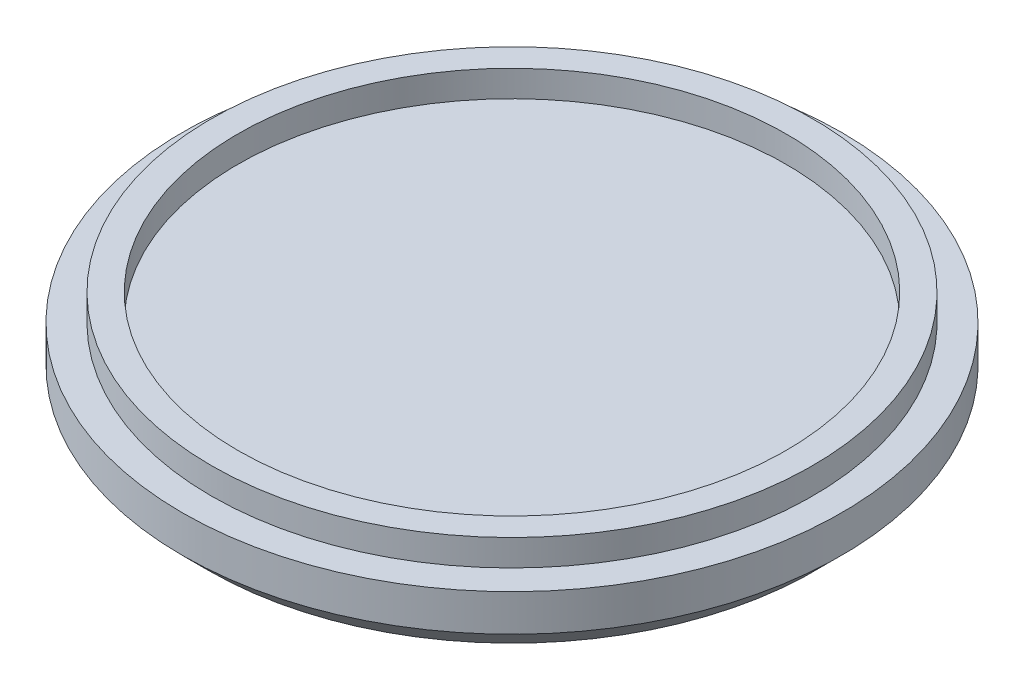
ISO-10303-21;
HEADER;
FILE_DESCRIPTION(('STEP AP214'),'2;1');
FILE_NAME('part.step','',(''),(''),'','','');
FILE_SCHEMA(('AUTOMOTIVE_DESIGN { 1 0 10303 214 1 1 1 1 }'));
ENDSEC;
DATA;
#1=APPLICATION_CONTEXT('core data for automotive mechanical design processes');
#2=APPLICATION_PROTOCOL_DEFINITION('international standard','automotive_design',2000,#1);
#3=PRODUCT_CONTEXT('',#1,'mechanical');
#4=PRODUCT('Part','Part','',(#3));
#5=PRODUCT_RELATED_PRODUCT_CATEGORY('part','',(#4));
#6=PRODUCT_DEFINITION_FORMATION('','',#4);
#7=PRODUCT_DEFINITION_CONTEXT('part definition',#1,'design');
#8=PRODUCT_DEFINITION('design','',#6,#7);
#9=PRODUCT_DEFINITION_SHAPE('','',#8);
#10=(LENGTH_UNIT() NAMED_UNIT(*) SI_UNIT(.MILLI.,.METRE.));
#11=(NAMED_UNIT(*) PLANE_ANGLE_UNIT() SI_UNIT($,.RADIAN.));
#12=(NAMED_UNIT(*) SI_UNIT($,.STERADIAN.) SOLID_ANGLE_UNIT());
#13=UNCERTAINTY_MEASURE_WITH_UNIT(LENGTH_MEASURE(1.E-05),#10,'distance_accuracy_value','');
#14=(GEOMETRIC_REPRESENTATION_CONTEXT(3) GLOBAL_UNCERTAINTY_ASSIGNED_CONTEXT((#13)) GLOBAL_UNIT_ASSIGNED_CONTEXT((#10,
#11,#12)) REPRESENTATION_CONTEXT('',''));
#15=CARTESIAN_POINT('',(0.,0.,0.));
#16=DIRECTION('',(0.,0.,1.));
#17=DIRECTION('',(1.,0.,0.));
#18=AXIS2_PLACEMENT_3D('',#15,#16,#17);
#19=CARTESIAN_POINT('',(0.,-1.,0.));
#20=DIRECTION('',(0.,1.,0.));
#21=DIRECTION('',(0.,0.,1.));
#22=AXIS2_PLACEMENT_3D('',#19,#20,#21);
#23=PLANE('',#22);
#24=CARTESIAN_POINT('',(0.,-1.,0.));
#25=DIRECTION('',(0.,1.,0.));
#26=DIRECTION('',(0.,0.,1.));
#27=AXIS2_PLACEMENT_3D('',#24,#25,#26);
#28=CIRCLE('',#27,11.5);
#29=CARTESIAN_POINT('',(0.,-1.,11.5));
#30=VERTEX_POINT('',#29);
#31=EDGE_CURVE('E11',#30,#30,#28,.F.);
#32=ORIENTED_EDGE('',*,*,#31,.T.);
#33=EDGE_LOOP('',(#32));
#34=FACE_BOUND('',#33,.T.);
#35=CARTESIAN_POINT('',(5.367578125,-1.,5.43046875));
#36=CARTESIAN_POINT('',(5.36437230296155,-1.,5.35440191543509));
#37=CARTESIAN_POINT('',(5.35815827664223,-1.,5.20695726431481));
#38=CARTESIAN_POINT('',(5.29648330608868,-1.,4.99729757865907));
#39=CARTESIAN_POINT('',(5.19277992319313,-1.,4.81306964596893));
#40=CARTESIAN_POINT('',(5.05070631821768,-1.,4.65323275377291));
#41=CARTESIAN_POINT('',(4.86555527245483,-1.,4.52562779840332));
#42=CARTESIAN_POINT('',(4.63797949496496,-1.,4.43505410252606));
#43=CARTESIAN_POINT('',(4.36887539757215,-1.,4.38586525879475));
#44=CARTESIAN_POINT('',(4.17650128704972,-1.,4.37877159736387));
#45=CARTESIAN_POINT('',(4.07421875,-1.,4.375));
#46=B_SPLINE_CURVE_WITH_KNOTS('',3,(#35,#36,#37,#38,#39,#40,#41,#42,#43,#44,#45),.UNSPECIFIED.,
.F.,.F.,(4,1,1,1,1,1,1,1,4),(0.,0.120267436748243,0.233121180260789,0.342370477685897,
0.452806012897153,0.568964289925495,0.695252155971452,0.837969971307345,1.),.UNSPECIFIED.);
#47=CARTESIAN_POINT('',(5.367578125,-1.,5.43046875));
#48=VERTEX_POINT('',#47);
#49=CARTESIAN_POINT('',(4.07421875,-1.,4.375));
#50=VERTEX_POINT('',#49);
#51=EDGE_CURVE('E48',#48,#50,#46,.T.);
#52=ORIENTED_EDGE('',*,*,#51,.T.);
#53=DIRECTION('',(-1.,0.,0.));
#54=VECTOR('',#53,1.);
#55=CARTESIAN_POINT('',(4.07421875,-1.,4.375));
#56=LINE('',#55,#54);
#57=CARTESIAN_POINT('',(-2.1,-1.,4.375));
#58=VERTEX_POINT('',#57);
#59=EDGE_CURVE('E379',#50,#58,#56,.T.);
#60=ORIENTED_EDGE('',*,*,#59,.T.);
#61=DIRECTION('',(0.,0.,-1.));
#62=VECTOR('',#61,1.);
#63=CARTESIAN_POINT('',(-2.1,-1.,4.375));
#64=LINE('',#63,#62);
#65=CARTESIAN_POINT('',(-2.1,-1.,1.05));
#66=VERTEX_POINT('',#65);
#67=EDGE_CURVE('E373',#58,#66,#64,.T.);
#68=ORIENTED_EDGE('',*,*,#67,.T.);
#69=DIRECTION('',(1.,0.,0.));
#70=VECTOR('',#69,1.);
#71=CARTESIAN_POINT('',(-2.1,-1.,1.05));
#72=LINE('',#71,#70);
#73=CARTESIAN_POINT('',(3.584765625,-1.,1.05));
#74=VERTEX_POINT('',#73);
#75=EDGE_CURVE('E378',#66,#74,#72,.T.);
#76=ORIENTED_EDGE('',*,*,#75,.T.);
#77=CARTESIAN_POINT('',(3.584765625,-1.,1.05));
#78=CARTESIAN_POINT('',(3.68341449567231,-1.,1.04626656115688));
#79=CARTESIAN_POINT('',(3.86858414946334,-1.,1.0392586798368));
#80=CARTESIAN_POINT('',(4.1277865845284,-1.,0.989689139155299));
#81=CARTESIAN_POINT('',(4.34699953762024,-1.,0.89870666903668));
#82=CARTESIAN_POINT('',(4.52533846175112,-1.,0.771743668816875));
#83=CARTESIAN_POINT('',(4.66230356322709,-1.,0.613832259418921));
#84=CARTESIAN_POINT('',(4.76298643354768,-1.,0.433813713452389));
#85=CARTESIAN_POINT('',(4.82184761778007,-1.,0.227789390492696));
#86=CARTESIAN_POINT('',(4.82829028696809,-1.,0.0833269557132631));
#87=CARTESIAN_POINT('',(4.831640625,-1.,0.00820312499999996));
#88=B_SPLINE_CURVE_WITH_KNOTS('',3,(#77,#78,#79,#80,#81,#82,#83,#84,#85,#86,#87),.UNSPECIFIED.,
.F.,.F.,(4,1,1,1,1,1,1,1,4),(0.,0.160661654013715,0.301571246061575,0.42729825318686,
0.544300414853506,0.654763056228304,0.76506598287453,0.877828839322363,1.),.UNSPECIFIED.);
#89=CARTESIAN_POINT('',(4.831640625,-1.,0.00820312499999996));
#90=VERTEX_POINT('',#89);
#91=EDGE_CURVE('E385',#74,#90,#88,.T.);
#92=ORIENTED_EDGE('',*,*,#91,.T.);
#93=CARTESIAN_POINT('',(4.831640625,-1.,0.00820312499999997));
#94=CARTESIAN_POINT('',(4.82838441400993,-1.,-0.0669667363365613));
#95=CARTESIAN_POINT('',(4.82212275025669,-1.,-0.211517687580781));
#96=CARTESIAN_POINT('',(4.76188896519159,-1.,-0.417277321257992));
#97=CARTESIAN_POINT('',(4.66492270443365,-1.,-0.601078260333811));
#98=CARTESIAN_POINT('',(4.52926834917098,-1.,-0.762310942338436));
#99=CARTESIAN_POINT('',(4.35240605689093,-1.,-0.893955903013384));
#100=CARTESIAN_POINT('',(4.13263734813538,-1.,-0.987206531621962));
#101=CARTESIAN_POINT('',(3.87160916719781,-1.,-1.03998696544967));
#102=CARTESIAN_POINT('',(3.68436834679015,-1.,-1.0465231028492));
#103=CARTESIAN_POINT('',(3.584765625,-1.,-1.05));
#104=B_SPLINE_CURVE_WITH_KNOTS('',3,(#93,#94,#95,#96,#97,#98,#99,#100,#101,#102,#103),
.UNSPECIFIED.,.F.,.F.,(4,1,1,1,1,1,1,1,4),(0.,0.121400030250187,0.233451140413456,
0.343651818902743,0.455654369536033,0.57159941871975,0.697114970678647,0.838880361428578,1.),.UNSPECIFIED.);
#105=CARTESIAN_POINT('',(3.584765625,-1.,-1.05));
#106=VERTEX_POINT('',#105);
#107=EDGE_CURVE('E390',#90,#106,#104,.T.);
#108=ORIENTED_EDGE('',*,*,#107,.T.);
#109=DIRECTION('',(-1.,0.,0.));
#110=VECTOR('',#109,1.);
#111=CARTESIAN_POINT('',(3.584765625,-1.,-1.05));
#112=LINE('',#111,#110);
#113=CARTESIAN_POINT('',(-2.1,-1.,-1.05));
#114=VERTEX_POINT('',#113);
#115=EDGE_CURVE('E398',#106,#114,#112,.T.);
#116=ORIENTED_EDGE('',*,*,#115,.T.);
#117=DIRECTION('',(0.,0.,-1.));
#118=VECTOR('',#117,1.);
#119=CARTESIAN_POINT('',(-2.1,-1.,-1.05));
#120=LINE('',#119,#118);
#121=CARTESIAN_POINT('',(-2.1,-1.,-4.9));
#122=VERTEX_POINT('',#121);
#123=EDGE_CURVE('E404',#114,#122,#120,.T.);
#124=ORIENTED_EDGE('',*,*,#123,.T.);
#125=DIRECTION('',(1.,0.,0.));
#126=VECTOR('',#125,1.);
#127=CARTESIAN_POINT('',(-2.1,-1.,-4.9));
#128=LINE('',#127,#126);
#129=CARTESIAN_POINT('',(4.2875,-1.,-4.9));
#130=VERTEX_POINT('',#129);
#131=EDGE_CURVE('E407',#122,#130,#128,.T.);
#132=ORIENTED_EDGE('',*,*,#131,.T.);
#133=CARTESIAN_POINT('',(4.2875,-1.,-4.9));
#134=CARTESIAN_POINT('',(4.38886184812434,-1.,-4.90379275059417));
#135=CARTESIAN_POINT('',(4.5794112832911,-1.,-4.91092271612677));
#136=CARTESIAN_POINT('',(4.84799230211396,-1.,-4.96015881419502));
#137=CARTESIAN_POINT('',(5.07559711195545,-1.,-5.05368552483259));
#138=CARTESIAN_POINT('',(5.26354382497766,-1.,-5.18172291774743));
#139=CARTESIAN_POINT('',(5.4120720353827,-1.,-5.3388727124249));
#140=CARTESIAN_POINT('',(5.51423593448541,-1.,-5.52574012933387));
#141=CARTESIAN_POINT('',(5.58059817021118,-1.,-5.73409934249324));
#142=CARTESIAN_POINT('',(5.58618524402794,-1.,-5.88202415245683));
#143=CARTESIAN_POINT('',(5.5890625,-1.,-5.958203125));
#144=B_SPLINE_CURVE_WITH_KNOTS('',3,(#133,#134,#135,#136,#137,#138,#139,#140,#141,#142,#143),
.UNSPECIFIED.,.F.,.F.,(4,1,1,1,1,1,1,1,4),(0.,0.160176505908495,0.301114702352376,
0.428957738056688,0.546002067235564,0.6580950950732,0.767063780429466,0.880041475940768,1.),.UNSPECIFIED.);
#145=CARTESIAN_POINT('',(5.5890625,-1.,-5.958203125));
#146=VERTEX_POINT('',#145);
#147=EDGE_CURVE('E410',#130,#146,#144,.T.);
#148=ORIENTED_EDGE('',*,*,#147,.T.);
#149=CARTESIAN_POINT('',(5.5890625,-1.,-5.958203125));
#150=CARTESIAN_POINT('',(5.58633538018358,-1.,-6.03261807672392));
#151=CARTESIAN_POINT('',(5.58107292391009,-1.,-6.17621478530384));
#152=CARTESIAN_POINT('',(5.51303845753953,-1.,-6.37858834799083));
#153=CARTESIAN_POINT('',(5.41133352125437,-1.,-6.5616104927131));
#154=CARTESIAN_POINT('',(5.26351397034971,-1.,-6.71807976456861));
#155=CARTESIAN_POINT('',(5.07623013844445,-1.,-6.84709167358586));
#156=CARTESIAN_POINT('',(4.84693187950366,-1.,-6.93546425434473));
#157=CARTESIAN_POINT('',(4.57991783779053,-1.,-6.99038682997221));
#158=CARTESIAN_POINT('',(4.38897467859842,-1.,-6.99666404297955));
#159=CARTESIAN_POINT('',(4.2875,-1.,-7.));
#160=B_SPLINE_CURVE_WITH_KNOTS('',3,(#149,#150,#151,#152,#153,#154,#155,#156,#157,#158,#159),
.UNSPECIFIED.,.F.,.F.,(4,1,1,1,1,1,1,1,4),(0.,0.118093013228401,0.22788119340316,
0.336519929743449,0.449574496185942,0.567622836436301,0.696013187536239,0.838449493433363,1.),.UNSPECIFIED.);
#161=CARTESIAN_POINT('',(4.2875,-1.,-7.));
#162=VERTEX_POINT('',#161);
#163=EDGE_CURVE('E415',#146,#162,#160,.T.);
#164=ORIENTED_EDGE('',*,*,#163,.T.);
#165=DIRECTION('',(-1.,0.,0.));
#166=VECTOR('',#165,1.);
#167=CARTESIAN_POINT('',(4.2875,-1.,-7.));
#168=LINE('',#167,#166);
#169=CARTESIAN_POINT('',(-3.1171875,-1.,-7.));
#170=VERTEX_POINT('',#169);
#171=EDGE_CURVE('E423',#162,#170,#168,.T.);
#172=ORIENTED_EDGE('',*,*,#171,.T.);
#173=CARTESIAN_POINT('',(-3.1171875,-1.,-7.));
#174=CARTESIAN_POINT('',(-3.25066868467936,-1.,-6.99611551407907));
#175=CARTESIAN_POINT('',(-3.49906251297289,-1.,-6.98888691230145));
#176=CARTESIAN_POINT('',(-3.8432108007353,-1.,-6.91545739975956));
#177=CARTESIAN_POINT('',(-4.13006516991292,-1.,-6.79400226117398));
#178=CARTESIAN_POINT('',(-4.36192116553861,-1.,-6.61532370776271));
#179=CARTESIAN_POINT('',(-4.529538591319,-1.,-6.37269325533188));
#180=CARTESIAN_POINT('',(-4.64656338462461,-1.,-6.07559185061921));
#181=CARTESIAN_POINT('',(-4.71182823399441,-1.,-5.71943912615384));
#182=CARTESIAN_POINT('',(-4.7204071678615,-1.,-5.46355372762279));
#183=CARTESIAN_POINT('',(-4.725,-1.,-5.3265625));
#184=B_SPLINE_CURVE_WITH_KNOTS('',3,(#173,#174,#175,#176,#177,#178,#179,#180,#181,#182,#183),
.UNSPECIFIED.,.F.,.F.,(4,1,1,1,1,1,1,1,4),(0.,0.148682021362969,0.276680916291554,
0.389999231123065,0.493501638371598,0.598426672552619,0.714696995015976,0.847259714225205,1.),.UNSPECIFIED.);
#185=CARTESIAN_POINT('',(-4.725,-1.,-5.3265625));
#186=VERTEX_POINT('',#185);
#187=EDGE_CURVE('E237',#170,#186,#184,.T.);
#188=ORIENTED_EDGE('',*,*,#187,.T.);
#189=DIRECTION('',(0.,0.,1.));
#190=VECTOR('',#189,1.);
#191=CARTESIAN_POINT('',(-4.725,-1.,-5.3265625));
#192=LINE('',#191,#190);
#193=CARTESIAN_POINT('',(-4.725,-1.,4.8015625));
#194=VERTEX_POINT('',#193);
#195=EDGE_CURVE('E431',#186,#194,#192,.T.);
#196=ORIENTED_EDGE('',*,*,#195,.T.);
#197=CARTESIAN_POINT('',(-4.725,-1.,4.8015625));
#198=CARTESIAN_POINT('',(-4.72289779159157,-1.,4.89552937523254));
#199=CARTESIAN_POINT('',(-4.7189059328463,-1.,5.07396196600636));
#200=CARTESIAN_POINT('',(-4.68921580138169,-1.,5.32867023836611));
#201=CARTESIAN_POINT('',(-4.63869875914601,-1.,5.55670945994587));
#202=CARTESIAN_POINT('',(-4.56438018871056,-1.,5.75913159386267));
#203=CARTESIAN_POINT('',(-4.46949905085583,-1.,5.9373047813468));
#204=CARTESIAN_POINT('',(-4.34645141256345,-1.,6.08809929208549));
#205=CARTESIAN_POINT('',(-4.19939462791895,-1.,6.21204695528725));
#206=CARTESIAN_POINT('',(-4.02955356301455,-1.,6.31260917234554));
#207=CARTESIAN_POINT('',(-3.83445723867178,-1.,6.38451080521653));
#208=CARTESIAN_POINT('',(-3.61760933418587,-1.,6.44045174902036));
#209=CARTESIAN_POINT('',(-3.37493357291449,-1.,6.46836998625932));
#210=CARTESIAN_POINT('',(-3.20565362263131,-1.,6.47272438197798));
#211=CARTESIAN_POINT('',(-3.1171875,-1.,6.475));
#212=B_SPLINE_CURVE_WITH_KNOTS('',3,(#197,#198,#199,#200,#201,#202,#203,#204,#205,#206,#207,
#208,#209,#210,#211),.UNSPECIFIED.,.F.,.F.,(4,1,1,1,1,1,1,1,1,1,1,1,4),(0.,0.104758116804265,
0.19892395208114,0.285459035487324,0.36456110534906,0.438695516580397,0.509487423231466,
0.580147895594877,0.65213343509275,0.72838325770038,0.811204159196715,0.901334824491364,1.),.UNSPECIFIED.);
#213=CARTESIAN_POINT('',(-3.1171875,-1.,6.475));
#214=VERTEX_POINT('',#213);
#215=EDGE_CURVE('E437',#194,#214,#212,.T.);
#216=ORIENTED_EDGE('',*,*,#215,.T.);
#217=DIRECTION('',(1.,0.,0.));
#218=VECTOR('',#217,1.);
#219=CARTESIAN_POINT('',(-3.1171875,-1.,6.475));
#220=LINE('',#219,#218);
#221=CARTESIAN_POINT('',(4.07421875,-1.,6.475));
#222=VERTEX_POINT('',#221);
#223=EDGE_CURVE('E176',#214,#222,#220,.T.);
#224=ORIENTED_EDGE('',*,*,#223,.T.);
#225=CARTESIAN_POINT('',(4.07421875,-1.,6.475));
#226=CARTESIAN_POINT('',(4.17645748059266,-1.,6.4711267649805));
#227=CARTESIAN_POINT('',(4.36874919945318,-1.,6.46384194233908));
#228=CARTESIAN_POINT('',(4.63873950663626,-1.,6.41584694775768));
#229=CARTESIAN_POINT('',(4.86487627937923,-1.,6.32101396932608));
#230=CARTESIAN_POINT('',(5.05099486883944,-1.,6.19434624982811));
#231=CARTESIAN_POINT('',(5.19096954122455,-1.,6.03491856439499));
#232=CARTESIAN_POINT('',(5.29730221534378,-1.,5.85517912332123));
#233=CARTESIAN_POINT('',(5.35773804968325,-1.,5.64934083002644));
#234=CARTESIAN_POINT('',(5.36424200862952,-1.,5.5046737439368));
#235=CARTESIAN_POINT('',(5.367578125,-1.,5.43046875));
#236=B_SPLINE_CURVE_WITH_KNOTS('',3,(#225,#226,#227,#228,#229,#230,#231,#232,#233,#234,#235),
.UNSPECIFIED.,.F.,.F.,(4,1,1,1,1,1,1,1,4),(0.,0.163044135156241,0.306655186518622,
0.434288730944417,0.551174014321422,0.662300738634914,0.769708499501093,0.881875139258483,1.),.UNSPECIFIED.);
#237=EDGE_CURVE('E330',#222,#48,#236,.T.);
#238=ORIENTED_EDGE('',*,*,#237,.T.);
#239=EDGE_LOOP('',(#52,#60,#68,#76,#92,#108,#116,#124,#132,#148,#164,#172,#188,#196,#216,#224,#238));
#240=FACE_BOUND('',#239,.T.);
#241=ADVANCED_FACE('F33',(#34,#240),#23,.F.);
#242=CARTESIAN_POINT('',(0.,-1.,0.));
#243=DIRECTION('',(0.,1.,0.));
#244=DIRECTION('',(0.,0.,1.));
#245=AXIS2_PLACEMENT_3D('',#242,#243,#244);
#246=CYLINDRICAL_SURFACE('',#245,12.5);
#247=CARTESIAN_POINT('',(0.,0.,0.));
#248=DIRECTION('',(0.,1.,0.));
#249=DIRECTION('',(0.,0.,1.));
#250=AXIS2_PLACEMENT_3D('',#247,#248,#249);
#251=CIRCLE('',#250,12.5);
#252=CARTESIAN_POINT('',(0.,0.,12.5));
#253=VERTEX_POINT('',#252);
#254=EDGE_CURVE('E41',#253,#253,#251,.T.);
#255=ORIENTED_EDGE('',*,*,#254,.T.);
#256=EDGE_LOOP('',(#255));
#257=FACE_BOUND('',#256,.T.);
#258=CARTESIAN_POINT('',(0.,1.4,0.));
#259=DIRECTION('',(0.,1.,0.));
#260=DIRECTION('',(0.,0.,1.));
#261=AXIS2_PLACEMENT_3D('',#258,#259,#260);
#262=CIRCLE('',#261,12.5);
#263=CARTESIAN_POINT('',(0.,1.4,12.5));
#264=VERTEX_POINT('',#263);
#265=EDGE_CURVE('E274',#264,#264,#262,.T.);
#266=ORIENTED_EDGE('',*,*,#265,.F.);
#267=EDGE_LOOP('',(#266));
#268=FACE_BOUND('',#267,.T.);
#269=ADVANCED_FACE('F284',(#257,#268),#246,.T.);
#270=CARTESIAN_POINT('',(0.,1.4,0.));
#271=DIRECTION('',(0.,1.,0.));
#272=DIRECTION('',(0.,0.,1.));
#273=AXIS2_PLACEMENT_3D('',#270,#271,#272);
#274=PLANE('',#273);
#275=CARTESIAN_POINT('',(0.,1.4,0.));
#276=DIRECTION('',(0.,1.,0.));
#277=DIRECTION('',(0.,0.,1.));
#278=AXIS2_PLACEMENT_3D('',#275,#276,#277);
#279=CIRCLE('',#278,11.4);
#280=CARTESIAN_POINT('',(0.,1.4,11.4));
#281=VERTEX_POINT('',#280);
#282=EDGE_CURVE('E270',#281,#281,#279,.T.);
#283=ORIENTED_EDGE('',*,*,#282,.F.);
#284=EDGE_LOOP('',(#283));
#285=FACE_BOUND('',#284,.T.);
#286=ORIENTED_EDGE('',*,*,#265,.T.);
#287=EDGE_LOOP('',(#286));
#288=FACE_BOUND('',#287,.T.);
#289=ADVANCED_FACE('F300',(#285,#288),#274,.T.);
#290=CARTESIAN_POINT('',(0.,2.4,0.));
#291=DIRECTION('',(0.,1.,0.));
#292=DIRECTION('',(0.,0.,1.));
#293=AXIS2_PLACEMENT_3D('',#290,#291,#292);
#294=PLANE('',#293);
#295=CARTESIAN_POINT('',(0.,2.4,0.));
#296=DIRECTION('',(0.,1.,0.));
#297=DIRECTION('',(0.,0.,1.));
#298=AXIS2_PLACEMENT_3D('',#295,#296,#297);
#299=CIRCLE('',#298,11.4);
#300=CARTESIAN_POINT('',(0.,2.4,11.4));
#301=VERTEX_POINT('',#300);
#302=EDGE_CURVE('E271',#301,#301,#299,.T.);
#303=ORIENTED_EDGE('',*,*,#302,.T.);
#304=EDGE_LOOP('',(#303));
#305=FACE_BOUND('',#304,.T.);
#306=CARTESIAN_POINT('',(0.,2.4,0.));
#307=DIRECTION('',(0.,1.,0.));
#308=DIRECTION('',(0.,0.,1.));
#309=AXIS2_PLACEMENT_3D('',#306,#307,#308);
#310=CIRCLE('',#309,10.4);
#311=CARTESIAN_POINT('',(0.,2.4,10.4));
#312=VERTEX_POINT('',#311);
#313=EDGE_CURVE('E267',#312,#312,#310,.T.);
#314=ORIENTED_EDGE('',*,*,#313,.F.);
#315=EDGE_LOOP('',(#314));
#316=FACE_BOUND('',#315,.T.);
#317=ADVANCED_FACE('F311',(#305,#316),#294,.T.);
#318=CARTESIAN_POINT('',(0.,2.4,0.));
#319=DIRECTION('',(0.,-1.,0.));
#320=DIRECTION('',(0.,0.,-1.));
#321=AXIS2_PLACEMENT_3D('',#318,#319,#320);
#322=CYLINDRICAL_SURFACE('',#321,11.4);
#323=ORIENTED_EDGE('',*,*,#302,.F.);
#324=EDGE_LOOP('',(#323));
#325=FACE_BOUND('',#324,.T.);
#326=ORIENTED_EDGE('',*,*,#282,.T.);
#327=EDGE_LOOP('',(#326));
#328=FACE_BOUND('',#327,.T.);
#329=ADVANCED_FACE('F313',(#325,#328),#322,.T.);
#330=CARTESIAN_POINT('',(0.,2.4,0.));
#331=DIRECTION('',(0.,-1.,0.));
#332=DIRECTION('',(0.,0.,-1.));
#333=AXIS2_PLACEMENT_3D('',#330,#331,#332);
#334=CYLINDRICAL_SURFACE('',#333,10.4);
#335=ORIENTED_EDGE('',*,*,#313,.T.);
#336=EDGE_LOOP('',(#335));
#337=FACE_BOUND('',#336,.T.);
#338=CARTESIAN_POINT('',(0.,1.4,0.));
#339=DIRECTION('',(0.,1.,0.));
#340=DIRECTION('',(0.,0.,1.));
#341=AXIS2_PLACEMENT_3D('',#338,#339,#340);
#342=CIRCLE('',#341,10.4);
#343=CARTESIAN_POINT('',(0.,1.4,10.4));
#344=VERTEX_POINT('',#343);
#345=EDGE_CURVE('E279',#344,#344,#342,.F.);
#346=ORIENTED_EDGE('',*,*,#345,.T.);
#347=EDGE_LOOP('',(#346));
#348=FACE_BOUND('',#347,.T.);
#349=ADVANCED_FACE('F297',(#337,#348),#334,.F.);
#350=ORIENTED_EDGE('',*,*,#345,.F.);
#351=EDGE_LOOP('',(#350));
#352=FACE_BOUND('',#351,.T.);
#353=ADVANCED_FACE('F289',(#352),#274,.T.);
#354=CARTESIAN_POINT('',(0.,0.,0.));
#355=DIRECTION('',(0.,1.,0.));
#356=DIRECTION('',(0.,0.,1.));
#357=AXIS2_PLACEMENT_3D('',#354,#355,#356);
#358=CONICAL_SURFACE('',#357,12.5,0.78539816339745);
#359=ORIENTED_EDGE('',*,*,#31,.F.);
#360=EDGE_LOOP('',(#359));
#361=FACE_BOUND('',#360,.T.);
#362=ORIENTED_EDGE('',*,*,#254,.F.);
#363=EDGE_LOOP('',(#362));
#364=FACE_BOUND('',#363,.T.);
#365=ADVANCED_FACE('F35',(#361,#364),#358,.T.);
#366=CARTESIAN_POINT('',(5.367578125,-0.6,5.43046875));
#367=CARTESIAN_POINT('',(5.36437230296155,-0.6,5.35440191543509));
#368=CARTESIAN_POINT('',(5.35815827664223,-0.6,5.20695726431481));
#369=CARTESIAN_POINT('',(5.29648330608868,-0.600000000000001,4.99729757865907));
#370=CARTESIAN_POINT('',(5.19277992319313,-0.6,4.81306964596893));
#371=CARTESIAN_POINT('',(5.05070631821768,-0.600000000000001,4.65323275377291));
#372=CARTESIAN_POINT('',(4.86555527245483,-0.6,4.52562779840332));
#373=CARTESIAN_POINT('',(4.63797949496496,-0.6,4.43505410252606));
#374=CARTESIAN_POINT('',(4.36887539757215,-0.6,4.38586525879475));
#375=CARTESIAN_POINT('',(4.17650128704972,-0.6,4.37877159736387));
#376=CARTESIAN_POINT('',(4.07421875,-0.6,4.375));
#377=B_SPLINE_CURVE_WITH_KNOTS('',3,(#366,#367,#368,#369,#370,#371,#372,#373,#374,#375,#376),
.UNSPECIFIED.,.F.,.F.,(4,1,1,1,1,1,1,1,4),(0.,0.120267436748243,0.233121180260789,
0.342370477685897,0.452806012897153,0.568964289925495,0.695252155971452,0.837969971307345,1.),.UNSPECIFIED.);
#378=DIRECTION('',(0.,-1.,0.));
#379=VECTOR('',#378,1.);
#380=SURFACE_OF_LINEAR_EXTRUSION('',#377,#379);
#381=ORIENTED_EDGE('',*,*,#51,.F.);
#382=DIRECTION('',(0.,-1.,0.));
#383=VECTOR('',#382,1.);
#384=CARTESIAN_POINT('',(5.367578125,-0.6,5.43046875));
#385=LINE('',#384,#383);
#386=CARTESIAN_POINT('',(5.367578125,-0.6,5.43046875));
#387=VERTEX_POINT('',#386);
#388=EDGE_CURVE('E181',#387,#48,#385,.T.);
#389=ORIENTED_EDGE('',*,*,#388,.F.);
#390=CARTESIAN_POINT('',(4.07421875,-0.6,4.375));
#391=VERTEX_POINT('',#390);
#392=EDGE_CURVE('E325',#387,#391,#377,.T.);
#393=ORIENTED_EDGE('',*,*,#392,.T.);
#394=DIRECTION('',(0.,-1.,0.));
#395=VECTOR('',#394,1.);
#396=CARTESIAN_POINT('',(4.07421875,-0.6,4.375));
#397=LINE('',#396,#395);
#398=EDGE_CURVE('E265',#391,#50,#397,.T.);
#399=ORIENTED_EDGE('',*,*,#398,.T.);
#400=EDGE_LOOP('',(#381,#389,#393,#399));
#401=FACE_BOUND('',#400,.T.);
#402=ADVANCED_FACE('F288',(#401),#380,.T.);
#403=CARTESIAN_POINT('',(4.07421875,-0.6,4.375));
#404=DIRECTION('',(0.,0.,1.));
#405=DIRECTION('',(1.,0.,0.));
#406=AXIS2_PLACEMENT_3D('',#403,#404,#405);
#407=PLANE('',#406);
#408=ORIENTED_EDGE('',*,*,#59,.F.);
#409=ORIENTED_EDGE('',*,*,#398,.F.);
#410=DIRECTION('',(-1.,0.,0.));
#411=VECTOR('',#410,1.);
#412=CARTESIAN_POINT('',(4.07421875,-0.6,4.375));
#413=LINE('',#412,#411);
#414=CARTESIAN_POINT('',(-2.1,-0.6,4.375));
#415=VERTEX_POINT('',#414);
#416=EDGE_CURVE('E120',#391,#415,#413,.T.);
#417=ORIENTED_EDGE('',*,*,#416,.T.);
#418=DIRECTION('',(0.,-1.,0.));
#419=VECTOR('',#418,1.);
#420=CARTESIAN_POINT('',(-2.1,-0.6,4.375));
#421=LINE('',#420,#419);
#422=EDGE_CURVE('E263',#415,#58,#421,.T.);
#423=ORIENTED_EDGE('',*,*,#422,.T.);
#424=EDGE_LOOP('',(#408,#409,#417,#423));
#425=FACE_BOUND('',#424,.T.);
#426=ADVANCED_FACE('F295',(#425),#407,.T.);
#427=CARTESIAN_POINT('',(-2.1,-0.6,4.375));
#428=DIRECTION('',(-1.,0.,0.));
#429=DIRECTION('',(0.,0.,1.));
#430=AXIS2_PLACEMENT_3D('',#427,#428,#429);
#431=PLANE('',#430);
#432=ORIENTED_EDGE('',*,*,#67,.F.);
#433=ORIENTED_EDGE('',*,*,#422,.F.);
#434=DIRECTION('',(0.,0.,-1.));
#435=VECTOR('',#434,1.);
#436=CARTESIAN_POINT('',(-2.1,-0.6,4.375));
#437=LINE('',#436,#435);
#438=CARTESIAN_POINT('',(-2.1,-0.6,1.05));
#439=VERTEX_POINT('',#438);
#440=EDGE_CURVE('E335',#415,#439,#437,.T.);
#441=ORIENTED_EDGE('',*,*,#440,.T.);
#442=DIRECTION('',(0.,-1.,0.));
#443=VECTOR('',#442,1.);
#444=CARTESIAN_POINT('',(-2.1,-0.6,1.05));
#445=LINE('',#444,#443);
#446=EDGE_CURVE('E261',#439,#66,#445,.T.);
#447=ORIENTED_EDGE('',*,*,#446,.T.);
#448=EDGE_LOOP('',(#432,#433,#441,#447));
#449=FACE_BOUND('',#448,.T.);
#450=ADVANCED_FACE('F362',(#449),#431,.T.);
#451=CARTESIAN_POINT('',(-2.1,-0.6,1.05));
#452=DIRECTION('',(0.,0.,-1.));
#453=DIRECTION('',(-1.,0.,0.));
#454=AXIS2_PLACEMENT_3D('',#451,#452,#453);
#455=PLANE('',#454);
#456=ORIENTED_EDGE('',*,*,#75,.F.);
#457=ORIENTED_EDGE('',*,*,#446,.F.);
#458=DIRECTION('',(1.,0.,0.));
#459=VECTOR('',#458,1.);
#460=CARTESIAN_POINT('',(-2.1,-0.6,1.05));
#461=LINE('',#460,#459);
#462=CARTESIAN_POINT('',(3.584765625,-0.6,1.05));
#463=VERTEX_POINT('',#462);
#464=EDGE_CURVE('E337',#439,#463,#461,.T.);
#465=ORIENTED_EDGE('',*,*,#464,.T.);
#466=DIRECTION('',(0.,-1.,0.));
#467=VECTOR('',#466,1.);
#468=CARTESIAN_POINT('',(3.584765625,-0.6,1.05));
#469=LINE('',#468,#467);
#470=EDGE_CURVE('E259',#463,#74,#469,.T.);
#471=ORIENTED_EDGE('',*,*,#470,.T.);
#472=EDGE_LOOP('',(#456,#457,#465,#471));
#473=FACE_BOUND('',#472,.T.);
#474=ADVANCED_FACE('F358',(#473),#455,.T.);
#475=CARTESIAN_POINT('',(3.584765625,-0.6,1.05));
#476=CARTESIAN_POINT('',(3.68341449567231,-0.6,1.04626656115688));
#477=CARTESIAN_POINT('',(3.86858414946334,-0.6,1.0392586798368));
#478=CARTESIAN_POINT('',(4.1277865845284,-0.6,0.989689139155299));
#479=CARTESIAN_POINT('',(4.34699953762024,-0.6,0.89870666903668));
#480=CARTESIAN_POINT('',(4.52533846175112,-0.6,0.771743668816875));
#481=CARTESIAN_POINT('',(4.66230356322709,-0.6,0.613832259418921));
#482=CARTESIAN_POINT('',(4.76298643354768,-0.6,0.433813713452389));
#483=CARTESIAN_POINT('',(4.82184761778007,-0.6,0.227789390492696));
#484=CARTESIAN_POINT('',(4.82829028696809,-0.6,0.0833269557132631));
#485=CARTESIAN_POINT('',(4.831640625,-0.6,0.00820312499999996));
#486=B_SPLINE_CURVE_WITH_KNOTS('',3,(#475,#476,#477,#478,#479,#480,#481,#482,#483,#484,#485),
.UNSPECIFIED.,.F.,.F.,(4,1,1,1,1,1,1,1,4),(0.,0.160661654013715,0.301571246061575,
0.42729825318686,0.544300414853506,0.654763056228304,0.76506598287453,0.877828839322363,1.),.UNSPECIFIED.);
#487=DIRECTION('',(0.,-1.,0.));
#488=VECTOR('',#487,1.);
#489=SURFACE_OF_LINEAR_EXTRUSION('',#486,#488);
#490=ORIENTED_EDGE('',*,*,#91,.F.);
#491=ORIENTED_EDGE('',*,*,#470,.F.);
#492=CARTESIAN_POINT('',(4.831640625,-0.6,0.00820312499999996));
#493=VERTEX_POINT('',#492);
#494=EDGE_CURVE('E339',#463,#493,#486,.T.);
#495=ORIENTED_EDGE('',*,*,#494,.T.);
#496=DIRECTION('',(0.,-1.,0.));
#497=VECTOR('',#496,1.);
#498=CARTESIAN_POINT('',(4.831640625,-0.6,0.00820312499999996));
#499=LINE('',#498,#497);
#500=EDGE_CURVE('E257',#493,#90,#499,.T.);
#501=ORIENTED_EDGE('',*,*,#500,.T.);
#502=EDGE_LOOP('',(#490,#491,#495,#501));
#503=FACE_BOUND('',#502,.T.);
#504=ADVANCED_FACE('F353',(#503),#489,.T.);
#505=CARTESIAN_POINT('',(4.831640625,-0.6,0.00820312499999997));
#506=CARTESIAN_POINT('',(4.82838441400993,-0.6,-0.0669667363365613));
#507=CARTESIAN_POINT('',(4.82212275025669,-0.6,-0.211517687580781));
#508=CARTESIAN_POINT('',(4.76188896519159,-0.6,-0.417277321257992));
#509=CARTESIAN_POINT('',(4.66492270443365,-0.6,-0.601078260333811));
#510=CARTESIAN_POINT('',(4.52926834917098,-0.6,-0.762310942338436));
#511=CARTESIAN_POINT('',(4.35240605689093,-0.6,-0.893955903013384));
#512=CARTESIAN_POINT('',(4.13263734813538,-0.6,-0.987206531621962));
#513=CARTESIAN_POINT('',(3.87160916719781,-0.6,-1.03998696544967));
#514=CARTESIAN_POINT('',(3.68436834679015,-0.6,-1.0465231028492));
#515=CARTESIAN_POINT('',(3.584765625,-0.6,-1.05));
#516=B_SPLINE_CURVE_WITH_KNOTS('',3,(#505,#506,#507,#508,#509,#510,#511,#512,#513,#514,#515),
.UNSPECIFIED.,.F.,.F.,(4,1,1,1,1,1,1,1,4),(0.,0.121400030250187,0.233451140413456,
0.343651818902743,0.455654369536033,0.57159941871975,0.697114970678647,0.838880361428578,1.),.UNSPECIFIED.);
#517=DIRECTION('',(0.,-1.,0.));
#518=VECTOR('',#517,1.);
#519=SURFACE_OF_LINEAR_EXTRUSION('',#516,#518);
#520=ORIENTED_EDGE('',*,*,#107,.F.);
#521=ORIENTED_EDGE('',*,*,#500,.F.);
#522=CARTESIAN_POINT('',(3.584765625,-0.6,-1.05));
#523=VERTEX_POINT('',#522);
#524=EDGE_CURVE('E344',#493,#523,#516,.T.);
#525=ORIENTED_EDGE('',*,*,#524,.T.);
#526=DIRECTION('',(0.,-1.,0.));
#527=VECTOR('',#526,1.);
#528=CARTESIAN_POINT('',(3.584765625,-0.6,-1.05));
#529=LINE('',#528,#527);
#530=EDGE_CURVE('E255',#523,#106,#529,.T.);
#531=ORIENTED_EDGE('',*,*,#530,.T.);
#532=EDGE_LOOP('',(#520,#521,#525,#531));
#533=FACE_BOUND('',#532,.T.);
#534=ADVANCED_FACE('F357',(#533),#519,.T.);
#535=CARTESIAN_POINT('',(3.584765625,-0.6,-1.05));
#536=DIRECTION('',(0.,0.,1.));
#537=DIRECTION('',(1.,0.,0.));
#538=AXIS2_PLACEMENT_3D('',#535,#536,#537);
#539=PLANE('',#538);
#540=ORIENTED_EDGE('',*,*,#115,.F.);
#541=ORIENTED_EDGE('',*,*,#530,.F.);
#542=DIRECTION('',(-1.,0.,0.));
#543=VECTOR('',#542,1.);
#544=CARTESIAN_POINT('',(3.584765625,-0.6,-1.05));
#545=LINE('',#544,#543);
#546=CARTESIAN_POINT('',(-2.1,-0.6,-1.05));
#547=VERTEX_POINT('',#546);
#548=EDGE_CURVE('E502',#523,#547,#545,.T.);
#549=ORIENTED_EDGE('',*,*,#548,.T.);
#550=DIRECTION('',(0.,-1.,0.));
#551=VECTOR('',#550,1.);
#552=CARTESIAN_POINT('',(-2.1,-0.6,-1.05));
#553=LINE('',#552,#551);
#554=EDGE_CURVE('E253',#547,#114,#553,.T.);
#555=ORIENTED_EDGE('',*,*,#554,.T.);
#556=EDGE_LOOP('',(#540,#541,#549,#555));
#557=FACE_BOUND('',#556,.T.);
#558=ADVANCED_FACE('F484',(#557),#539,.T.);
#559=CARTESIAN_POINT('',(-2.1,-0.6,-1.05));
#560=DIRECTION('',(-1.,0.,0.));
#561=DIRECTION('',(0.,0.,1.));
#562=AXIS2_PLACEMENT_3D('',#559,#560,#561);
#563=PLANE('',#562);
#564=ORIENTED_EDGE('',*,*,#123,.F.);
#565=ORIENTED_EDGE('',*,*,#554,.F.);
#566=DIRECTION('',(0.,0.,-1.));
#567=VECTOR('',#566,1.);
#568=CARTESIAN_POINT('',(-2.1,-0.6,-1.05));
#569=LINE('',#568,#567);
#570=CARTESIAN_POINT('',(-2.1,-0.6,-4.9));
#571=VERTEX_POINT('',#570);
#572=EDGE_CURVE('E503',#547,#571,#569,.T.);
#573=ORIENTED_EDGE('',*,*,#572,.T.);
#574=DIRECTION('',(0.,-1.,0.));
#575=VECTOR('',#574,1.);
#576=CARTESIAN_POINT('',(-2.1,-0.6,-4.9));
#577=LINE('',#576,#575);
#578=EDGE_CURVE('E251',#571,#122,#577,.T.);
#579=ORIENTED_EDGE('',*,*,#578,.T.);
#580=EDGE_LOOP('',(#564,#565,#573,#579));
#581=FACE_BOUND('',#580,.T.);
#582=ADVANCED_FACE('F481',(#581),#563,.T.);
#583=CARTESIAN_POINT('',(-2.1,-0.6,-4.9));
#584=DIRECTION('',(0.,0.,-1.));
#585=DIRECTION('',(-1.,0.,0.));
#586=AXIS2_PLACEMENT_3D('',#583,#584,#585);
#587=PLANE('',#586);
#588=ORIENTED_EDGE('',*,*,#131,.F.);
#589=ORIENTED_EDGE('',*,*,#578,.F.);
#590=DIRECTION('',(1.,0.,0.));
#591=VECTOR('',#590,1.);
#592=CARTESIAN_POINT('',(-2.1,-0.6,-4.9));
#593=LINE('',#592,#591);
#594=CARTESIAN_POINT('',(4.2875,-0.6,-4.9));
#595=VERTEX_POINT('',#594);
#596=EDGE_CURVE('E460',#571,#595,#593,.T.);
#597=ORIENTED_EDGE('',*,*,#596,.T.);
#598=DIRECTION('',(0.,-1.,0.));
#599=VECTOR('',#598,1.);
#600=CARTESIAN_POINT('',(4.2875,-0.6,-4.9));
#601=LINE('',#600,#599);
#602=EDGE_CURVE('E249',#595,#130,#601,.T.);
#603=ORIENTED_EDGE('',*,*,#602,.T.);
#604=EDGE_LOOP('',(#588,#589,#597,#603));
#605=FACE_BOUND('',#604,.T.);
#606=ADVANCED_FACE('F477',(#605),#587,.T.);
#607=CARTESIAN_POINT('',(4.2875,-0.6,-4.9));
#608=CARTESIAN_POINT('',(4.38886184812434,-0.6,-4.90379275059417));
#609=CARTESIAN_POINT('',(4.5794112832911,-0.6,-4.91092271612677));
#610=CARTESIAN_POINT('',(4.84799230211396,-0.6,-4.96015881419502));
#611=CARTESIAN_POINT('',(5.07559711195545,-0.6,-5.05368552483259));
#612=CARTESIAN_POINT('',(5.26354382497766,-0.6,-5.18172291774743));
#613=CARTESIAN_POINT('',(5.4120720353827,-0.6,-5.3388727124249));
#614=CARTESIAN_POINT('',(5.51423593448541,-0.6,-5.52574012933387));
#615=CARTESIAN_POINT('',(5.58059817021118,-0.6,-5.73409934249324));
#616=CARTESIAN_POINT('',(5.58618524402794,-0.6,-5.88202415245683));
#617=CARTESIAN_POINT('',(5.5890625,-0.6,-5.958203125));
#618=B_SPLINE_CURVE_WITH_KNOTS('',3,(#607,#608,#609,#610,#611,#612,#613,#614,#615,#616,#617),
.UNSPECIFIED.,.F.,.F.,(4,1,1,1,1,1,1,1,4),(0.,0.160176505908495,0.301114702352376,
0.428957738056688,0.546002067235564,0.6580950950732,0.767063780429466,0.880041475940768,1.),.UNSPECIFIED.);
#619=DIRECTION('',(0.,-1.,0.));
#620=VECTOR('',#619,1.);
#621=SURFACE_OF_LINEAR_EXTRUSION('',#618,#620);
#622=ORIENTED_EDGE('',*,*,#147,.F.);
#623=ORIENTED_EDGE('',*,*,#602,.F.);
#624=CARTESIAN_POINT('',(5.5890625,-0.6,-5.958203125));
#625=VERTEX_POINT('',#624);
#626=EDGE_CURVE('E459',#595,#625,#618,.T.);
#627=ORIENTED_EDGE('',*,*,#626,.T.);
#628=DIRECTION('',(0.,-1.,0.));
#629=VECTOR('',#628,1.);
#630=CARTESIAN_POINT('',(5.5890625,-0.6,-5.958203125));
#631=LINE('',#630,#629);
#632=EDGE_CURVE('E243',#625,#146,#631,.T.);
#633=ORIENTED_EDGE('',*,*,#632,.T.);
#634=EDGE_LOOP('',(#622,#623,#627,#633));
#635=FACE_BOUND('',#634,.T.);
#636=ADVANCED_FACE('F474',(#635),#621,.T.);
#637=CARTESIAN_POINT('',(5.5890625,-0.6,-5.958203125));
#638=CARTESIAN_POINT('',(5.58633538018358,-0.6,-6.03261807672392));
#639=CARTESIAN_POINT('',(5.58107292391009,-0.6,-6.17621478530384));
#640=CARTESIAN_POINT('',(5.51303845753953,-0.6,-6.37858834799083));
#641=CARTESIAN_POINT('',(5.41133352125437,-0.6,-6.5616104927131));
#642=CARTESIAN_POINT('',(5.26351397034971,-0.6,-6.71807976456861));
#643=CARTESIAN_POINT('',(5.07623013844445,-0.6,-6.84709167358586));
#644=CARTESIAN_POINT('',(4.84693187950366,-0.6,-6.93546425434473));
#645=CARTESIAN_POINT('',(4.57991783779053,-0.6,-6.99038682997221));
#646=CARTESIAN_POINT('',(4.38897467859842,-0.6,-6.99666404297955));
#647=CARTESIAN_POINT('',(4.2875,-0.6,-7.));
#648=B_SPLINE_CURVE_WITH_KNOTS('',3,(#637,#638,#639,#640,#641,#642,#643,#644,#645,#646,#647),
.UNSPECIFIED.,.F.,.F.,(4,1,1,1,1,1,1,1,4),(0.,0.118093013228401,0.22788119340316,
0.336519929743449,0.449574496185942,0.567622836436301,0.696013187536239,0.838449493433363,1.),.UNSPECIFIED.);
#649=DIRECTION('',(0.,-1.,0.));
#650=VECTOR('',#649,1.);
#651=SURFACE_OF_LINEAR_EXTRUSION('',#648,#650);
#652=ORIENTED_EDGE('',*,*,#163,.F.);
#653=ORIENTED_EDGE('',*,*,#632,.F.);
#654=CARTESIAN_POINT('',(4.2875,-0.6,-7.));
#655=VERTEX_POINT('',#654);
#656=EDGE_CURVE('E457',#625,#655,#648,.T.);
#657=ORIENTED_EDGE('',*,*,#656,.T.);
#658=DIRECTION('',(0.,-1.,0.));
#659=VECTOR('',#658,1.);
#660=CARTESIAN_POINT('',(4.2875,-0.6,-7.));
#661=LINE('',#660,#659);
#662=EDGE_CURVE('E241',#655,#162,#661,.T.);
#663=ORIENTED_EDGE('',*,*,#662,.T.);
#664=EDGE_LOOP('',(#652,#653,#657,#663));
#665=FACE_BOUND('',#664,.T.);
#666=ADVANCED_FACE('F455',(#665),#651,.T.);
#667=CARTESIAN_POINT('',(4.2875,-0.6,-7.));
#668=DIRECTION('',(0.,0.,1.));
#669=DIRECTION('',(1.,0.,0.));
#670=AXIS2_PLACEMENT_3D('',#667,#668,#669);
#671=PLANE('',#670);
#672=ORIENTED_EDGE('',*,*,#171,.F.);
#673=ORIENTED_EDGE('',*,*,#662,.F.);
#674=DIRECTION('',(-1.,0.,0.));
#675=VECTOR('',#674,1.);
#676=CARTESIAN_POINT('',(4.2875,-0.6,-7.));
#677=LINE('',#676,#675);
#678=CARTESIAN_POINT('',(-3.1171875,-0.6,-7.));
#679=VERTEX_POINT('',#678);
#680=EDGE_CURVE('E222',#655,#679,#677,.T.);
#681=ORIENTED_EDGE('',*,*,#680,.T.);
#682=DIRECTION('',(0.,-1.,0.));
#683=VECTOR('',#682,1.);
#684=CARTESIAN_POINT('',(-3.1171875,-0.6,-7.));
#685=LINE('',#684,#683);
#686=EDGE_CURVE('E235',#679,#170,#685,.T.);
#687=ORIENTED_EDGE('',*,*,#686,.T.);
#688=EDGE_LOOP('',(#672,#673,#681,#687));
#689=FACE_BOUND('',#688,.T.);
#690=ADVANCED_FACE('F214',(#689),#671,.T.);
#691=CARTESIAN_POINT('',(-3.1171875,-0.6,-7.));
#692=CARTESIAN_POINT('',(-3.25066868467936,-0.6,-6.99611551407907));
#693=CARTESIAN_POINT('',(-3.49906251297289,-0.6,-6.98888691230145));
#694=CARTESIAN_POINT('',(-3.8432108007353,-0.6,-6.91545739975956));
#695=CARTESIAN_POINT('',(-4.13006516991292,-0.6,-6.79400226117398));
#696=CARTESIAN_POINT('',(-4.36192116553861,-0.6,-6.61532370776271));
#697=CARTESIAN_POINT('',(-4.529538591319,-0.6,-6.37269325533188));
#698=CARTESIAN_POINT('',(-4.64656338462461,-0.6,-6.07559185061921));
#699=CARTESIAN_POINT('',(-4.71182823399441,-0.6,-5.71943912615384));
#700=CARTESIAN_POINT('',(-4.7204071678615,-0.6,-5.46355372762279));
#701=CARTESIAN_POINT('',(-4.725,-0.6,-5.3265625));
#702=B_SPLINE_CURVE_WITH_KNOTS('',3,(#691,#692,#693,#694,#695,#696,#697,#698,#699,#700,#701),
.UNSPECIFIED.,.F.,.F.,(4,1,1,1,1,1,1,1,4),(0.,0.148682021362969,0.276680916291554,
0.389999231123065,0.493501638371598,0.598426672552619,0.714696995015976,0.847259714225205,1.),.UNSPECIFIED.);
#703=DIRECTION('',(0.,-1.,0.));
#704=VECTOR('',#703,1.);
#705=SURFACE_OF_LINEAR_EXTRUSION('',#702,#704);
#706=ORIENTED_EDGE('',*,*,#187,.F.);
#707=ORIENTED_EDGE('',*,*,#686,.F.);
#708=CARTESIAN_POINT('',(-4.725,-0.6,-5.3265625));
#709=VERTEX_POINT('',#708);
#710=EDGE_CURVE('E217',#679,#709,#702,.T.);
#711=ORIENTED_EDGE('',*,*,#710,.T.);
#712=DIRECTION('',(0.,-1.,0.));
#713=VECTOR('',#712,1.);
#714=CARTESIAN_POINT('',(-4.725,-0.6,-5.3265625));
#715=LINE('',#714,#713);
#716=EDGE_CURVE('E229',#709,#186,#715,.T.);
#717=ORIENTED_EDGE('',*,*,#716,.T.);
#718=EDGE_LOOP('',(#706,#707,#711,#717));
#719=FACE_BOUND('',#718,.T.);
#720=ADVANCED_FACE('F209',(#719),#705,.T.);
#721=CARTESIAN_POINT('',(-4.725,-0.6,-5.3265625));
#722=DIRECTION('',(1.,0.,0.));
#723=DIRECTION('',(0.,0.,-1.));
#724=AXIS2_PLACEMENT_3D('',#721,#722,#723);
#725=PLANE('',#724);
#726=ORIENTED_EDGE('',*,*,#195,.F.);
#727=ORIENTED_EDGE('',*,*,#716,.F.);
#728=DIRECTION('',(0.,0.,1.));
#729=VECTOR('',#728,1.);
#730=CARTESIAN_POINT('',(-4.725,-0.6,-5.3265625));
#731=LINE('',#730,#729);
#732=CARTESIAN_POINT('',(-4.725,-0.6,4.8015625));
#733=VERTEX_POINT('',#732);
#734=EDGE_CURVE('E172',#709,#733,#731,.T.);
#735=ORIENTED_EDGE('',*,*,#734,.T.);
#736=DIRECTION('',(0.,-1.,0.));
#737=VECTOR('',#736,1.);
#738=CARTESIAN_POINT('',(-4.725,-0.6,4.8015625));
#739=LINE('',#738,#737);
#740=EDGE_CURVE('E168',#733,#194,#739,.T.);
#741=ORIENTED_EDGE('',*,*,#740,.T.);
#742=EDGE_LOOP('',(#726,#727,#735,#741));
#743=FACE_BOUND('',#742,.T.);
#744=ADVANCED_FACE('F206',(#743),#725,.T.);
#745=CARTESIAN_POINT('',(-4.725,-0.6,4.8015625));
#746=CARTESIAN_POINT('',(-4.72289779159157,-0.6,4.89552937523254));
#747=CARTESIAN_POINT('',(-4.7189059328463,-0.6,5.07396196600636));
#748=CARTESIAN_POINT('',(-4.68921580138169,-0.6,5.32867023836611));
#749=CARTESIAN_POINT('',(-4.63869875914601,-0.6,5.55670945994587));
#750=CARTESIAN_POINT('',(-4.56438018871056,-0.6,5.75913159386267));
#751=CARTESIAN_POINT('',(-4.46949905085583,-0.6,5.9373047813468));
#752=CARTESIAN_POINT('',(-4.34645141256345,-0.6,6.08809929208549));
#753=CARTESIAN_POINT('',(-4.19939462791895,-0.6,6.21204695528725));
#754=CARTESIAN_POINT('',(-4.02955356301455,-0.6,6.31260917234554));
#755=CARTESIAN_POINT('',(-3.83445723867178,-0.6,6.38451080521653));
#756=CARTESIAN_POINT('',(-3.61760933418587,-0.6,6.44045174902036));
#757=CARTESIAN_POINT('',(-3.37493357291449,-0.6,6.46836998625932));
#758=CARTESIAN_POINT('',(-3.20565362263131,-0.6,6.47272438197798));
#759=CARTESIAN_POINT('',(-3.1171875,-0.6,6.475));
#760=B_SPLINE_CURVE_WITH_KNOTS('',3,(#745,#746,#747,#748,#749,#750,#751,#752,#753,#754,#755,
#756,#757,#758,#759),.UNSPECIFIED.,.F.,.F.,(4,1,1,1,1,1,1,1,1,1,1,1,4),(0.,0.104758116804265,
0.19892395208114,0.285459035487324,0.36456110534906,0.438695516580397,0.509487423231466,
0.580147895594877,0.65213343509275,0.72838325770038,0.811204159196715,0.901334824491364,1.),.UNSPECIFIED.);
#761=DIRECTION('',(0.,-1.,0.));
#762=VECTOR('',#761,1.);
#763=SURFACE_OF_LINEAR_EXTRUSION('',#760,#762);
#764=ORIENTED_EDGE('',*,*,#215,.F.);
#765=ORIENTED_EDGE('',*,*,#740,.F.);
#766=CARTESIAN_POINT('',(-3.1171875,-0.6,6.475));
#767=VERTEX_POINT('',#766);
#768=EDGE_CURVE('E163',#733,#767,#760,.T.);
#769=ORIENTED_EDGE('',*,*,#768,.T.);
#770=DIRECTION('',(0.,-1.,0.));
#771=VECTOR('',#770,1.);
#772=CARTESIAN_POINT('',(-3.1171875,-0.6,6.475));
#773=LINE('',#772,#771);
#774=EDGE_CURVE('E167',#767,#214,#773,.T.);
#775=ORIENTED_EDGE('',*,*,#774,.T.);
#776=EDGE_LOOP('',(#764,#765,#769,#775));
#777=FACE_BOUND('',#776,.T.);
#778=ADVANCED_FACE('F166',(#777),#763,.T.);
#779=CARTESIAN_POINT('',(-3.1171875,-0.6,6.475));
#780=DIRECTION('',(0.,0.,-1.));
#781=DIRECTION('',(-1.,0.,0.));
#782=AXIS2_PLACEMENT_3D('',#779,#780,#781);
#783=PLANE('',#782);
#784=ORIENTED_EDGE('',*,*,#223,.F.);
#785=ORIENTED_EDGE('',*,*,#774,.F.);
#786=DIRECTION('',(1.,0.,0.));
#787=VECTOR('',#786,1.);
#788=CARTESIAN_POINT('',(-3.1171875,-0.6,6.475));
#789=LINE('',#788,#787);
#790=CARTESIAN_POINT('',(4.07421875,-0.6,6.475));
#791=VERTEX_POINT('',#790);
#792=EDGE_CURVE('E171',#767,#791,#789,.T.);
#793=ORIENTED_EDGE('',*,*,#792,.T.);
#794=DIRECTION('',(0.,-1.,0.));
#795=VECTOR('',#794,1.);
#796=CARTESIAN_POINT('',(4.07421875,-0.6,6.475));
#797=LINE('',#796,#795);
#798=EDGE_CURVE('E111',#791,#222,#797,.T.);
#799=ORIENTED_EDGE('',*,*,#798,.T.);
#800=EDGE_LOOP('',(#784,#785,#793,#799));
#801=FACE_BOUND('',#800,.T.);
#802=ADVANCED_FACE('F174',(#801),#783,.T.);
#803=CARTESIAN_POINT('',(4.07421875,-0.6,6.475));
#804=CARTESIAN_POINT('',(4.17645748059266,-0.6,6.4711267649805));
#805=CARTESIAN_POINT('',(4.36874919945318,-0.6,6.46384194233908));
#806=CARTESIAN_POINT('',(4.63873950663626,-0.6,6.41584694775768));
#807=CARTESIAN_POINT('',(4.86487627937923,-0.6,6.32101396932608));
#808=CARTESIAN_POINT('',(5.05099486883944,-0.6,6.19434624982811));
#809=CARTESIAN_POINT('',(5.19096954122455,-0.6,6.03491856439499));
#810=CARTESIAN_POINT('',(5.29730221534378,-0.6,5.85517912332123));
#811=CARTESIAN_POINT('',(5.35773804968325,-0.6,5.64934083002644));
#812=CARTESIAN_POINT('',(5.36424200862952,-0.6,5.5046737439368));
#813=CARTESIAN_POINT('',(5.367578125,-0.6,5.43046875));
#814=B_SPLINE_CURVE_WITH_KNOTS('',3,(#803,#804,#805,#806,#807,#808,#809,#810,#811,#812,#813),
.UNSPECIFIED.,.F.,.F.,(4,1,1,1,1,1,1,1,4),(0.,0.163044135156241,0.306655186518622,
0.434288730944417,0.551174014321422,0.662300738634914,0.769708499501093,0.881875139258483,1.),.UNSPECIFIED.);
#815=DIRECTION('',(0.,-1.,0.));
#816=VECTOR('',#815,1.);
#817=SURFACE_OF_LINEAR_EXTRUSION('',#814,#816);
#818=ORIENTED_EDGE('',*,*,#237,.F.);
#819=ORIENTED_EDGE('',*,*,#798,.F.);
#820=EDGE_CURVE('E56',#791,#387,#814,.T.);
#821=ORIENTED_EDGE('',*,*,#820,.T.);
#822=ORIENTED_EDGE('',*,*,#388,.T.);
#823=EDGE_LOOP('',(#818,#819,#821,#822));
#824=FACE_BOUND('',#823,.T.);
#825=ADVANCED_FACE('F198',(#824),#817,.T.);
#826=CARTESIAN_POINT('',(4.97790961141605,-0.6,4.60600150415285));
#827=DIRECTION('',(0.,-1.,0.));
#828=DIRECTION('',(1.,0.,0.));
#829=AXIS2_PLACEMENT_3D('',#826,#827,#828);
#830=PLANE('',#829);
#831=ORIENTED_EDGE('',*,*,#392,.F.);
#832=ORIENTED_EDGE('',*,*,#820,.F.);
#833=ORIENTED_EDGE('',*,*,#792,.F.);
#834=ORIENTED_EDGE('',*,*,#768,.F.);
#835=ORIENTED_EDGE('',*,*,#734,.F.);
#836=ORIENTED_EDGE('',*,*,#710,.F.);
#837=ORIENTED_EDGE('',*,*,#680,.F.);
#838=ORIENTED_EDGE('',*,*,#656,.F.);
#839=ORIENTED_EDGE('',*,*,#626,.F.);
#840=ORIENTED_EDGE('',*,*,#596,.F.);
#841=ORIENTED_EDGE('',*,*,#572,.F.);
#842=ORIENTED_EDGE('',*,*,#548,.F.);
#843=ORIENTED_EDGE('',*,*,#524,.F.);
#844=ORIENTED_EDGE('',*,*,#494,.F.);
#845=ORIENTED_EDGE('',*,*,#464,.F.);
#846=ORIENTED_EDGE('',*,*,#440,.F.);
#847=ORIENTED_EDGE('',*,*,#416,.F.);
#848=EDGE_LOOP('',(#831,#832,#833,#834,#835,#836,#837,#838,#839,#840,#841,#842,#843,#844,#845,
#846,#847));
#849=FACE_BOUND('',#848,.T.);
#850=ADVANCED_FACE('F179',(#849),#830,.T.);
#851=CLOSED_SHELL('',(#241,#269,#289,#317,#329,#349,#353,#365,#402,#426,#450,#474,#504,#534,
#558,#582,#606,#636,#666,#690,#720,#744,#778,#802,#825,#850));
#852=MANIFOLD_SOLID_BREP('B2',#851);
#853=ADVANCED_BREP_SHAPE_REPRESENTATION('',(#18,#852),#14);
#854=SHAPE_DEFINITION_REPRESENTATION(#9,#853);
ENDSEC;
END-ISO-10303-21;
